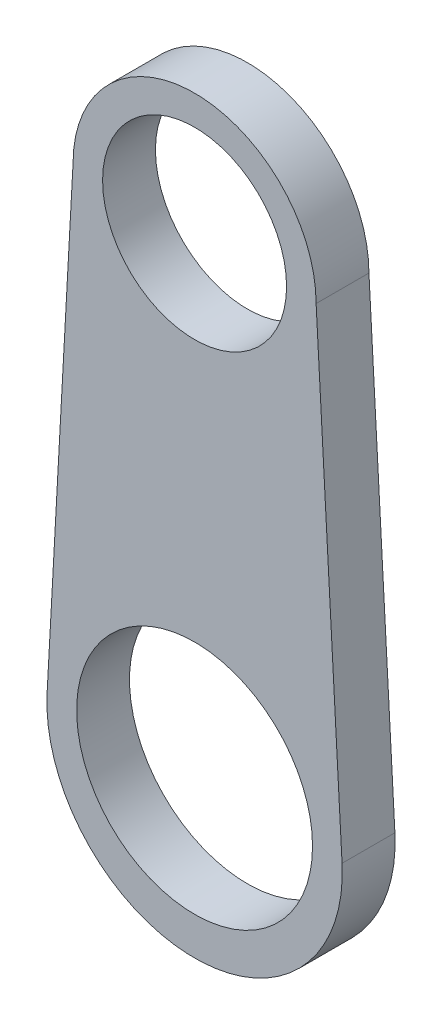
ISO-10303-21;
HEADER;
FILE_DESCRIPTION(('STEP AP214'),'2;1');
FILE_NAME('part.step','',(''),(''),'','','');
FILE_SCHEMA(('AUTOMOTIVE_DESIGN { 1 0 10303 214 1 1 1 1 }'));
ENDSEC;
DATA;
#1=APPLICATION_CONTEXT('core data for automotive mechanical design processes');
#2=APPLICATION_PROTOCOL_DEFINITION('international standard','automotive_design',2000,#1);
#3=PRODUCT_CONTEXT('',#1,'mechanical');
#4=PRODUCT('Part','Part','',(#3));
#5=PRODUCT_RELATED_PRODUCT_CATEGORY('part','',(#4));
#6=PRODUCT_DEFINITION_FORMATION('','',#4);
#7=PRODUCT_DEFINITION_CONTEXT('part definition',#1,'design');
#8=PRODUCT_DEFINITION('design','',#6,#7);
#9=PRODUCT_DEFINITION_SHAPE('','',#8);
#10=(LENGTH_UNIT() NAMED_UNIT(*) SI_UNIT(.MILLI.,.METRE.));
#11=(NAMED_UNIT(*) PLANE_ANGLE_UNIT() SI_UNIT($,.RADIAN.));
#12=(NAMED_UNIT(*) SI_UNIT($,.STERADIAN.) SOLID_ANGLE_UNIT());
#13=UNCERTAINTY_MEASURE_WITH_UNIT(LENGTH_MEASURE(1.E-05),#10,'distance_accuracy_value','');
#14=(GEOMETRIC_REPRESENTATION_CONTEXT(3) GLOBAL_UNCERTAINTY_ASSIGNED_CONTEXT((#13)) GLOBAL_UNIT_ASSIGNED_CONTEXT((#10,
#11,#12)) REPRESENTATION_CONTEXT('',''));
#15=CARTESIAN_POINT('',(0.,0.,0.));
#16=DIRECTION('',(0.,0.,1.));
#17=DIRECTION('',(1.,0.,0.));
#18=AXIS2_PLACEMENT_3D('',#15,#16,#17);
#19=CARTESIAN_POINT('',(0.,50.8,5.6896));
#20=DIRECTION('',(0.,0.,-1.));
#21=DIRECTION('',(-1.,0.,0.));
#22=AXIS2_PLACEMENT_3D('',#19,#20,#21);
#23=CYLINDRICAL_SURFACE('',#22,13.0857985613282);
#24=CARTESIAN_POINT('',(0.,50.8,0.));
#25=DIRECTION('',(0.,0.,1.));
#26=DIRECTION('',(1.,0.,0.));
#27=AXIS2_PLACEMENT_3D('',#24,#25,#26);
#28=CIRCLE('',#27,13.0857985613282);
#29=CARTESIAN_POINT('',(-13.0857985613282,50.8,0.));
#30=VERTEX_POINT('',#29);
#31=CARTESIAN_POINT('',(13.0857985613282,50.8,0.));
#32=VERTEX_POINT('',#31);
#33=EDGE_CURVE('E113',#30,#32,#28,.F.);
#34=ORIENTED_EDGE('',*,*,#33,.F.);
#35=DIRECTION('',(0.,0.,-1.));
#36=VECTOR('',#35,1.);
#37=CARTESIAN_POINT('',(-13.0857985613282,50.8,5.6896));
#38=LINE('',#37,#36);
#39=CARTESIAN_POINT('',(-13.0857985613282,50.8,5.6896));
#40=VERTEX_POINT('',#39);
#41=EDGE_CURVE('E11',#40,#30,#38,.T.);
#42=ORIENTED_EDGE('',*,*,#41,.F.);
#43=CARTESIAN_POINT('',(0.,50.8,5.6896));
#44=DIRECTION('',(0.,0.,1.));
#45=DIRECTION('',(1.,0.,0.));
#46=AXIS2_PLACEMENT_3D('',#43,#44,#45);
#47=CIRCLE('',#46,13.0857985613282);
#48=CARTESIAN_POINT('',(13.0857985613282,50.8,5.6896));
#49=VERTEX_POINT('',#48);
#50=EDGE_CURVE('E92',#40,#49,#47,.F.);
#51=ORIENTED_EDGE('',*,*,#50,.T.);
#52=DIRECTION('',(0.,0.,-1.));
#53=VECTOR('',#52,1.);
#54=CARTESIAN_POINT('',(13.0857985613282,50.8,5.6896));
#55=LINE('',#54,#53);
#56=EDGE_CURVE('E59',#49,#32,#55,.T.);
#57=ORIENTED_EDGE('',*,*,#56,.T.);
#58=EDGE_LOOP('',(#34,#42,#51,#57));
#59=FACE_BOUND('',#58,.T.);
#60=ADVANCED_FACE('F43',(#59),#23,.T.);
#61=CARTESIAN_POINT('',(-15.8319070425246,0.870754887338852,5.6896));
#62=DIRECTION('',(0.998490922857009,-0.0549170007571355,0.));
#63=DIRECTION('',(0.0549170007571355,0.998490922857009,0.));
#64=AXIS2_PLACEMENT_3D('',#61,#62,#63);
#65=PLANE('',#64);
#66=DIRECTION('',(-0.0549170007571355,-0.998490922857009,0.));
#67=VECTOR('',#66,1.);
#68=CARTESIAN_POINT('',(-15.8319070425246,0.870754887338852,0.));
#69=LINE('',#68,#67);
#70=CARTESIAN_POINT('',(-15.8797985613282,0.,0.));
#71=VERTEX_POINT('',#70);
#72=EDGE_CURVE('E98',#30,#71,#69,.T.);
#73=ORIENTED_EDGE('',*,*,#72,.T.);
#74=DIRECTION('',(0.,0.,-1.));
#75=VECTOR('',#74,1.);
#76=CARTESIAN_POINT('',(-15.8797985613282,0.,5.6896));
#77=LINE('',#76,#75);
#78=CARTESIAN_POINT('',(-15.8797985613282,0.,5.6896));
#79=VERTEX_POINT('',#78);
#80=EDGE_CURVE('E51',#79,#71,#77,.T.);
#81=ORIENTED_EDGE('',*,*,#80,.F.);
#82=DIRECTION('',(-0.0549170007571355,-0.998490922857009,0.));
#83=VECTOR('',#82,1.);
#84=CARTESIAN_POINT('',(-15.8319070425246,0.870754887338852,5.6896));
#85=LINE('',#84,#83);
#86=EDGE_CURVE('E85',#40,#79,#85,.T.);
#87=ORIENTED_EDGE('',*,*,#86,.F.);
#88=ORIENTED_EDGE('',*,*,#41,.T.);
#89=EDGE_LOOP('',(#73,#81,#87,#88));
#90=FACE_BOUND('',#89,.T.);
#91=ADVANCED_FACE('F96',(#90),#65,.F.);
#92=CARTESIAN_POINT('',(0.,-0.873388920873052,5.6896));
#93=DIRECTION('',(0.,0.,-1.));
#94=DIRECTION('',(-1.,0.,0.));
#95=AXIS2_PLACEMENT_3D('',#92,#93,#94);
#96=CYLINDRICAL_SURFACE('',#95,15.9037986203129);
#97=CARTESIAN_POINT('',(0.,-0.873388920873052,0.));
#98=DIRECTION('',(0.,0.,1.));
#99=DIRECTION('',(1.,0.,0.));
#100=AXIS2_PLACEMENT_3D('',#97,#98,#99);
#101=CIRCLE('',#100,15.9037986203129);
#102=CARTESIAN_POINT('',(15.8797985613282,0.,0.));
#103=VERTEX_POINT('',#102);
#104=EDGE_CURVE('E116',#71,#103,#101,.T.);
#105=ORIENTED_EDGE('',*,*,#104,.T.);
#106=DIRECTION('',(0.,0.,-1.));
#107=VECTOR('',#106,1.);
#108=CARTESIAN_POINT('',(15.8797985613282,0.,5.6896));
#109=LINE('',#108,#107);
#110=CARTESIAN_POINT('',(15.8797985613282,0.,5.6896));
#111=VERTEX_POINT('',#110);
#112=EDGE_CURVE('E73',#111,#103,#109,.T.);
#113=ORIENTED_EDGE('',*,*,#112,.F.);
#114=CARTESIAN_POINT('',(0.,-0.873388920873052,5.6896));
#115=DIRECTION('',(0.,0.,1.));
#116=DIRECTION('',(1.,0.,0.));
#117=AXIS2_PLACEMENT_3D('',#114,#115,#116);
#118=CIRCLE('',#117,15.9037986203129);
#119=EDGE_CURVE('E91',#79,#111,#118,.T.);
#120=ORIENTED_EDGE('',*,*,#119,.F.);
#121=ORIENTED_EDGE('',*,*,#80,.T.);
#122=EDGE_LOOP('',(#105,#113,#120,#121));
#123=FACE_BOUND('',#122,.T.);
#124=ADVANCED_FACE('F101',(#123),#96,.T.);
#125=CARTESIAN_POINT('',(0.,50.8,5.6896));
#126=DIRECTION('',(0.,0.,-1.));
#127=DIRECTION('',(-1.,0.,0.));
#128=AXIS2_PLACEMENT_3D('',#125,#126,#127);
#129=CYLINDRICAL_SURFACE('',#128,9.906);
#130=CARTESIAN_POINT('',(0.,50.8,5.6896));
#131=DIRECTION('',(0.,0.,1.));
#132=DIRECTION('',(1.,0.,0.));
#133=AXIS2_PLACEMENT_3D('',#130,#131,#132);
#134=CIRCLE('',#133,9.906);
#135=CARTESIAN_POINT('',(9.906,50.8,5.6896));
#136=VERTEX_POINT('',#135);
#137=EDGE_CURVE('E104',#136,#136,#134,.T.);
#138=ORIENTED_EDGE('',*,*,#137,.T.);
#139=EDGE_LOOP('',(#138));
#140=FACE_BOUND('',#139,.T.);
#141=CARTESIAN_POINT('',(0.,50.8,0.));
#142=DIRECTION('',(0.,0.,1.));
#143=DIRECTION('',(1.,0.,0.));
#144=AXIS2_PLACEMENT_3D('',#141,#142,#143);
#145=CIRCLE('',#144,9.906);
#146=CARTESIAN_POINT('',(9.906,50.8,0.));
#147=VERTEX_POINT('',#146);
#148=EDGE_CURVE('E121',#147,#147,#145,.T.);
#149=ORIENTED_EDGE('',*,*,#148,.F.);
#150=EDGE_LOOP('',(#149));
#151=FACE_BOUND('',#150,.T.);
#152=ADVANCED_FACE('F133',(#140,#151),#129,.F.);
#153=CARTESIAN_POINT('',(15.8319070425246,0.87075488733885,5.6896));
#154=DIRECTION('',(0.998490922857009,0.0549170007571353,0.));
#155=DIRECTION('',(-0.0549170007571353,0.998490922857009,0.));
#156=AXIS2_PLACEMENT_3D('',#153,#154,#155);
#157=PLANE('',#156);
#158=DIRECTION('',(0.0549170007571353,-0.998490922857009,0.));
#159=VECTOR('',#158,1.);
#160=CARTESIAN_POINT('',(15.8319070425246,0.87075488733885,0.));
#161=LINE('',#160,#159);
#162=EDGE_CURVE('E118',#32,#103,#161,.T.);
#163=ORIENTED_EDGE('',*,*,#162,.F.);
#164=ORIENTED_EDGE('',*,*,#56,.F.);
#165=DIRECTION('',(0.0549170007571353,-0.998490922857009,0.));
#166=VECTOR('',#165,1.);
#167=CARTESIAN_POINT('',(15.8319070425246,0.87075488733885,5.6896));
#168=LINE('',#167,#166);
#169=EDGE_CURVE('E102',#49,#111,#168,.T.);
#170=ORIENTED_EDGE('',*,*,#169,.T.);
#171=ORIENTED_EDGE('',*,*,#112,.T.);
#172=EDGE_LOOP('',(#163,#164,#170,#171));
#173=FACE_BOUND('',#172,.T.);
#174=ADVANCED_FACE('F130',(#173),#157,.T.);
#175=CARTESIAN_POINT('',(0.,0.,5.6896));
#176=DIRECTION('',(0.,0.,-1.));
#177=DIRECTION('',(-1.,0.,0.));
#178=AXIS2_PLACEMENT_3D('',#175,#176,#177);
#179=CYLINDRICAL_SURFACE('',#178,12.7);
#180=CARTESIAN_POINT('',(0.,0.,5.6896));
#181=DIRECTION('',(0.,0.,1.));
#182=DIRECTION('',(1.,0.,0.));
#183=AXIS2_PLACEMENT_3D('',#180,#181,#182);
#184=CIRCLE('',#183,12.7);
#185=CARTESIAN_POINT('',(12.7,0.,5.6896));
#186=VERTEX_POINT('',#185);
#187=EDGE_CURVE('E110',#186,#186,#184,.T.);
#188=ORIENTED_EDGE('',*,*,#187,.T.);
#189=EDGE_LOOP('',(#188));
#190=FACE_BOUND('',#189,.T.);
#191=CARTESIAN_POINT('',(0.,0.,0.));
#192=DIRECTION('',(0.,0.,1.));
#193=DIRECTION('',(1.,0.,0.));
#194=AXIS2_PLACEMENT_3D('',#191,#192,#193);
#195=CIRCLE('',#194,12.7);
#196=CARTESIAN_POINT('',(12.7,0.,0.));
#197=VERTEX_POINT('',#196);
#198=EDGE_CURVE('E124',#197,#197,#195,.T.);
#199=ORIENTED_EDGE('',*,*,#198,.F.);
#200=EDGE_LOOP('',(#199));
#201=FACE_BOUND('',#200,.T.);
#202=ADVANCED_FACE('F132',(#190,#201),#179,.F.);
#203=CARTESIAN_POINT('',(0.,0.,5.6896));
#204=DIRECTION('',(0.,0.,1.));
#205=DIRECTION('',(1.,0.,0.));
#206=AXIS2_PLACEMENT_3D('',#203,#204,#205);
#207=PLANE('',#206);
#208=ORIENTED_EDGE('',*,*,#50,.F.);
#209=ORIENTED_EDGE('',*,*,#86,.T.);
#210=ORIENTED_EDGE('',*,*,#119,.T.);
#211=ORIENTED_EDGE('',*,*,#169,.F.);
#212=EDGE_LOOP('',(#208,#209,#210,#211));
#213=FACE_BOUND('',#212,.T.);
#214=ORIENTED_EDGE('',*,*,#137,.F.);
#215=EDGE_LOOP('',(#214));
#216=FACE_BOUND('',#215,.T.);
#217=ORIENTED_EDGE('',*,*,#187,.F.);
#218=EDGE_LOOP('',(#217));
#219=FACE_BOUND('',#218,.T.);
#220=ADVANCED_FACE('F87',(#213,#216,#219),#207,.T.);
#221=CARTESIAN_POINT('',(0.,0.,0.));
#222=DIRECTION('',(0.,0.,1.));
#223=DIRECTION('',(1.,0.,0.));
#224=AXIS2_PLACEMENT_3D('',#221,#222,#223);
#225=PLANE('',#224);
#226=ORIENTED_EDGE('',*,*,#33,.T.);
#227=ORIENTED_EDGE('',*,*,#162,.T.);
#228=ORIENTED_EDGE('',*,*,#104,.F.);
#229=ORIENTED_EDGE('',*,*,#72,.F.);
#230=EDGE_LOOP('',(#226,#227,#228,#229));
#231=FACE_BOUND('',#230,.T.);
#232=ORIENTED_EDGE('',*,*,#148,.T.);
#233=EDGE_LOOP('',(#232));
#234=FACE_BOUND('',#233,.T.);
#235=ORIENTED_EDGE('',*,*,#198,.T.);
#236=EDGE_LOOP('',(#235));
#237=FACE_BOUND('',#236,.T.);
#238=ADVANCED_FACE('F178',(#231,#234,#237),#225,.F.);
#239=CLOSED_SHELL('',(#60,#91,#124,#152,#174,#202,#220,#238));
#240=MANIFOLD_SOLID_BREP('B2',#239);
#241=ADVANCED_BREP_SHAPE_REPRESENTATION('',(#18,#240),#14);
#242=SHAPE_DEFINITION_REPRESENTATION(#9,#241);
ENDSEC;
END-ISO-10303-21;
